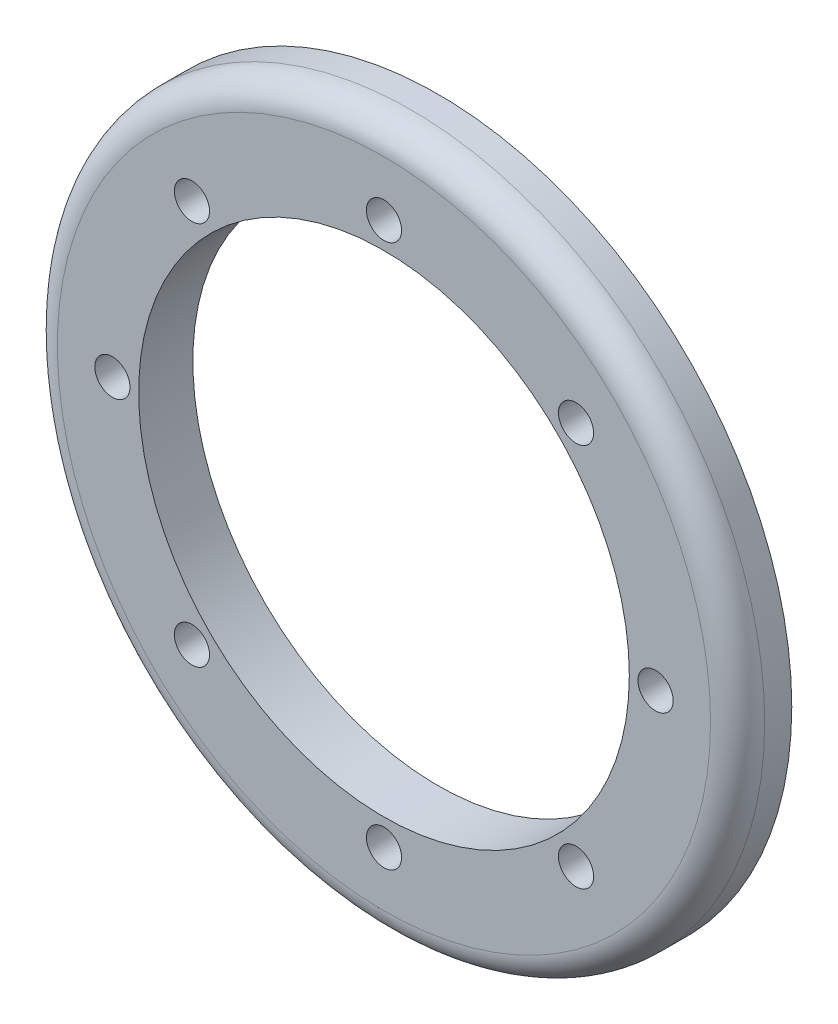
ISO-10303-21;
HEADER;
FILE_DESCRIPTION(('STEP AP214'),'2;1');
FILE_NAME('part.step','',(''),(''),'','','');
FILE_SCHEMA(('AUTOMOTIVE_DESIGN { 1 0 10303 214 1 1 1 1 }'));
ENDSEC;
DATA;
#1=APPLICATION_CONTEXT('core data for automotive mechanical design processes');
#2=APPLICATION_PROTOCOL_DEFINITION('international standard','automotive_design',2000,#1);
#3=PRODUCT_CONTEXT('',#1,'mechanical');
#4=PRODUCT('Part','Part','',(#3));
#5=PRODUCT_RELATED_PRODUCT_CATEGORY('part','',(#4));
#6=PRODUCT_DEFINITION_FORMATION('','',#4);
#7=PRODUCT_DEFINITION_CONTEXT('part definition',#1,'design');
#8=PRODUCT_DEFINITION('design','',#6,#7);
#9=PRODUCT_DEFINITION_SHAPE('','',#8);
#10=(LENGTH_UNIT() NAMED_UNIT(*) SI_UNIT(.MILLI.,.METRE.));
#11=(NAMED_UNIT(*) PLANE_ANGLE_UNIT() SI_UNIT($,.RADIAN.));
#12=(NAMED_UNIT(*) SI_UNIT($,.STERADIAN.) SOLID_ANGLE_UNIT());
#13=UNCERTAINTY_MEASURE_WITH_UNIT(LENGTH_MEASURE(1.E-05),#10,'distance_accuracy_value','');
#14=(GEOMETRIC_REPRESENTATION_CONTEXT(3) GLOBAL_UNCERTAINTY_ASSIGNED_CONTEXT((#13)) GLOBAL_UNIT_ASSIGNED_CONTEXT((#10,
#11,#12)) REPRESENTATION_CONTEXT('',''));
#15=CARTESIAN_POINT('',(0.,0.,0.));
#16=DIRECTION('',(0.,0.,1.));
#17=DIRECTION('',(1.,0.,0.));
#18=AXIS2_PLACEMENT_3D('',#15,#16,#17);
#19=CARTESIAN_POINT('',(35.4614050765051,-35.4614050765057,10.));
#20=DIRECTION('',(0.,0.,-1.));
#21=DIRECTION('',(-1.,0.,0.));
#22=AXIS2_PLACEMENT_3D('',#19,#20,#21);
#23=CYLINDRICAL_SURFACE('',#22,1.65);
#24=CARTESIAN_POINT('',(35.4614050765051,-35.4614050765057,0.));
#25=DIRECTION('',(0.,0.,1.));
#26=DIRECTION('',(1.,0.,0.));
#27=AXIS2_PLACEMENT_3D('',#24,#25,#26);
#28=CIRCLE('',#27,1.65);
#29=CARTESIAN_POINT('',(37.1114050765051,-35.4614050765057,0.));
#30=VERTEX_POINT('',#29);
#31=EDGE_CURVE('E104',#30,#30,#28,.T.);
#32=ORIENTED_EDGE('',*,*,#31,.F.);
#33=EDGE_LOOP('',(#32));
#34=FACE_BOUND('',#33,.T.);
#35=CARTESIAN_POINT('',(35.4614050765051,-35.4614050765057,4.));
#36=DIRECTION('',(0.,0.,1.));
#37=DIRECTION('',(1.,0.,0.));
#38=AXIS2_PLACEMENT_3D('',#35,#36,#37);
#39=CIRCLE('',#38,1.65);
#40=CARTESIAN_POINT('',(37.1114050765051,-35.4614050765057,4.));
#41=VERTEX_POINT('',#40);
#42=EDGE_CURVE('E39',#41,#41,#39,.T.);
#43=ORIENTED_EDGE('',*,*,#42,.T.);
#44=EDGE_LOOP('',(#43));
#45=FACE_BOUND('',#44,.T.);
#46=ADVANCED_FACE('F35',(#34,#45),#23,.F.);
#47=CARTESIAN_POINT('',(-5.20417042793042E-13,-50.15,10.));
#48=DIRECTION('',(0.,0.,-1.));
#49=DIRECTION('',(-1.,0.,0.));
#50=AXIS2_PLACEMENT_3D('',#47,#48,#49);
#51=CYLINDRICAL_SURFACE('',#50,1.65);
#52=CARTESIAN_POINT('',(-5.20417042793042E-13,-50.15,0.));
#53=DIRECTION('',(0.,0.,1.));
#54=DIRECTION('',(1.,0.,0.));
#55=AXIS2_PLACEMENT_3D('',#52,#53,#54);
#56=CIRCLE('',#55,1.65);
#57=CARTESIAN_POINT('',(1.64999999999948,-50.15,0.));
#58=VERTEX_POINT('',#57);
#59=EDGE_CURVE('E101',#58,#58,#56,.T.);
#60=ORIENTED_EDGE('',*,*,#59,.F.);
#61=EDGE_LOOP('',(#60));
#62=FACE_BOUND('',#61,.T.);
#63=CARTESIAN_POINT('',(-5.20417042793042E-13,-50.15,4.));
#64=DIRECTION('',(0.,0.,1.));
#65=DIRECTION('',(1.,0.,0.));
#66=AXIS2_PLACEMENT_3D('',#63,#64,#65);
#67=CIRCLE('',#66,1.65);
#68=CARTESIAN_POINT('',(1.64999999999948,-50.15,4.));
#69=VERTEX_POINT('',#68);
#70=EDGE_CURVE('E70',#69,#69,#67,.T.);
#71=ORIENTED_EDGE('',*,*,#70,.T.);
#72=EDGE_LOOP('',(#71));
#73=FACE_BOUND('',#72,.T.);
#74=ADVANCED_FACE('F231',(#62,#73),#51,.F.);
#75=CARTESIAN_POINT('',(-35.4614050765058,-35.4614050765049,10.));
#76=DIRECTION('',(0.,0.,-1.));
#77=DIRECTION('',(-1.,0.,0.));
#78=AXIS2_PLACEMENT_3D('',#75,#76,#77);
#79=CYLINDRICAL_SURFACE('',#78,1.65);
#80=CARTESIAN_POINT('',(-35.4614050765058,-35.4614050765049,0.));
#81=DIRECTION('',(0.,0.,1.));
#82=DIRECTION('',(1.,0.,0.));
#83=AXIS2_PLACEMENT_3D('',#80,#81,#82);
#84=CIRCLE('',#83,1.65);
#85=CARTESIAN_POINT('',(-33.8114050765058,-35.4614050765049,0.));
#86=VERTEX_POINT('',#85);
#87=EDGE_CURVE('E98',#86,#86,#84,.T.);
#88=ORIENTED_EDGE('',*,*,#87,.F.);
#89=EDGE_LOOP('',(#88));
#90=FACE_BOUND('',#89,.T.);
#91=CARTESIAN_POINT('',(-35.4614050765058,-35.4614050765049,4.));
#92=DIRECTION('',(0.,0.,1.));
#93=DIRECTION('',(1.,0.,0.));
#94=AXIS2_PLACEMENT_3D('',#91,#92,#93);
#95=CIRCLE('',#94,1.65);
#96=CARTESIAN_POINT('',(-33.8114050765058,-35.4614050765049,4.));
#97=VERTEX_POINT('',#96);
#98=EDGE_CURVE('E68',#97,#97,#95,.T.);
#99=ORIENTED_EDGE('',*,*,#98,.T.);
#100=EDGE_LOOP('',(#99));
#101=FACE_BOUND('',#100,.T.);
#102=ADVANCED_FACE('F237',(#90,#101),#79,.F.);
#103=CARTESIAN_POINT('',(-50.15,6.90419943438769E-13,10.));
#104=DIRECTION('',(0.,0.,-1.));
#105=DIRECTION('',(-1.,0.,0.));
#106=AXIS2_PLACEMENT_3D('',#103,#104,#105);
#107=CYLINDRICAL_SURFACE('',#106,1.65);
#108=CARTESIAN_POINT('',(-50.15,6.90419943438769E-13,0.));
#109=DIRECTION('',(0.,0.,1.));
#110=DIRECTION('',(1.,0.,0.));
#111=AXIS2_PLACEMENT_3D('',#108,#109,#110);
#112=CIRCLE('',#111,1.65);
#113=CARTESIAN_POINT('',(-48.5,6.90419943438769E-13,0.));
#114=VERTEX_POINT('',#113);
#115=EDGE_CURVE('E95',#114,#114,#112,.T.);
#116=ORIENTED_EDGE('',*,*,#115,.F.);
#117=EDGE_LOOP('',(#116));
#118=FACE_BOUND('',#117,.T.);
#119=CARTESIAN_POINT('',(-50.15,6.90419943438769E-13,4.));
#120=DIRECTION('',(0.,0.,1.));
#121=DIRECTION('',(1.,0.,0.));
#122=AXIS2_PLACEMENT_3D('',#119,#120,#121);
#123=CIRCLE('',#122,1.65);
#124=CARTESIAN_POINT('',(-48.5,6.90419943438769E-13,4.));
#125=VERTEX_POINT('',#124);
#126=EDGE_CURVE('E65',#125,#125,#123,.T.);
#127=ORIENTED_EDGE('',*,*,#126,.T.);
#128=EDGE_LOOP('',(#127));
#129=FACE_BOUND('',#128,.T.);
#130=ADVANCED_FACE('F243',(#118,#129),#107,.F.);
#131=CARTESIAN_POINT('',(-35.4614050765048,35.4614050765059,10.));
#132=DIRECTION('',(0.,0.,-1.));
#133=DIRECTION('',(-1.,0.,0.));
#134=AXIS2_PLACEMENT_3D('',#131,#132,#133);
#135=CYLINDRICAL_SURFACE('',#134,1.65000000000001);
#136=CARTESIAN_POINT('',(-35.4614050765048,35.4614050765059,0.));
#137=DIRECTION('',(0.,0.,1.));
#138=DIRECTION('',(1.,0.,0.));
#139=AXIS2_PLACEMENT_3D('',#136,#137,#138);
#140=CIRCLE('',#139,1.65000000000001);
#141=CARTESIAN_POINT('',(-33.8114050765048,35.4614050765059,0.));
#142=VERTEX_POINT('',#141);
#143=EDGE_CURVE('E92',#142,#142,#140,.T.);
#144=ORIENTED_EDGE('',*,*,#143,.F.);
#145=EDGE_LOOP('',(#144));
#146=FACE_BOUND('',#145,.T.);
#147=CARTESIAN_POINT('',(-35.4614050765048,35.4614050765059,4.));
#148=DIRECTION('',(0.,0.,1.));
#149=DIRECTION('',(1.,0.,0.));
#150=AXIS2_PLACEMENT_3D('',#147,#148,#149);
#151=CIRCLE('',#150,1.65000000000001);
#152=CARTESIAN_POINT('',(-33.8114050765048,35.4614050765059,4.));
#153=VERTEX_POINT('',#152);
#154=EDGE_CURVE('E62',#153,#153,#151,.T.);
#155=ORIENTED_EDGE('',*,*,#154,.T.);
#156=EDGE_LOOP('',(#155));
#157=FACE_BOUND('',#156,.T.);
#158=ADVANCED_FACE('F247',(#146,#157),#135,.F.);
#159=CARTESIAN_POINT('',(8.50014503228635E-13,50.15,10.));
#160=DIRECTION('',(0.,0.,-1.));
#161=DIRECTION('',(-1.,0.,0.));
#162=AXIS2_PLACEMENT_3D('',#159,#160,#161);
#163=CYLINDRICAL_SURFACE('',#162,1.65);
#164=CARTESIAN_POINT('',(8.50014503228635E-13,50.15,0.));
#165=DIRECTION('',(0.,0.,1.));
#166=DIRECTION('',(1.,0.,0.));
#167=AXIS2_PLACEMENT_3D('',#164,#165,#166);
#168=CIRCLE('',#167,1.65);
#169=CARTESIAN_POINT('',(1.65000000000085,50.15,0.));
#170=VERTEX_POINT('',#169);
#171=EDGE_CURVE('E84',#170,#170,#168,.T.);
#172=ORIENTED_EDGE('',*,*,#171,.F.);
#173=EDGE_LOOP('',(#172));
#174=FACE_BOUND('',#173,.T.);
#175=CARTESIAN_POINT('',(8.50014503228635E-13,50.15,4.));
#176=DIRECTION('',(0.,0.,1.));
#177=DIRECTION('',(1.,0.,0.));
#178=AXIS2_PLACEMENT_3D('',#175,#176,#177);
#179=CIRCLE('',#178,1.65);
#180=CARTESIAN_POINT('',(1.65000000000085,50.15,4.));
#181=VERTEX_POINT('',#180);
#182=EDGE_CURVE('E59',#181,#181,#179,.T.);
#183=ORIENTED_EDGE('',*,*,#182,.T.);
#184=EDGE_LOOP('',(#183));
#185=FACE_BOUND('',#184,.T.);
#186=ADVANCED_FACE('F142',(#174,#185),#163,.F.);
#187=CARTESIAN_POINT('',(35.461405076506,35.4614050765047,10.));
#188=DIRECTION('',(0.,0.,-1.));
#189=DIRECTION('',(-1.,0.,0.));
#190=AXIS2_PLACEMENT_3D('',#187,#188,#189);
#191=CYLINDRICAL_SURFACE('',#190,1.65);
#192=CARTESIAN_POINT('',(35.461405076506,35.4614050765047,0.));
#193=DIRECTION('',(0.,0.,1.));
#194=DIRECTION('',(1.,0.,0.));
#195=AXIS2_PLACEMENT_3D('',#192,#193,#194);
#196=CIRCLE('',#195,1.65);
#197=CARTESIAN_POINT('',(37.111405076506,35.4614050765047,0.));
#198=VERTEX_POINT('',#197);
#199=EDGE_CURVE('E79',#198,#198,#196,.T.);
#200=ORIENTED_EDGE('',*,*,#199,.F.);
#201=EDGE_LOOP('',(#200));
#202=FACE_BOUND('',#201,.T.);
#203=CARTESIAN_POINT('',(35.461405076506,35.4614050765047,4.));
#204=DIRECTION('',(0.,0.,1.));
#205=DIRECTION('',(1.,0.,0.));
#206=AXIS2_PLACEMENT_3D('',#203,#204,#205);
#207=CIRCLE('',#206,1.65);
#208=CARTESIAN_POINT('',(37.111405076506,35.4614050765047,4.));
#209=VERTEX_POINT('',#208);
#210=EDGE_CURVE('E55',#209,#209,#207,.T.);
#211=ORIENTED_EDGE('',*,*,#210,.T.);
#212=EDGE_LOOP('',(#211));
#213=FACE_BOUND('',#212,.T.);
#214=ADVANCED_FACE('F138',(#202,#213),#191,.F.);
#215=CARTESIAN_POINT('',(50.15,-1.03736463863413E-12,10.));
#216=DIRECTION('',(0.,0.,-1.));
#217=DIRECTION('',(-1.,0.,0.));
#218=AXIS2_PLACEMENT_3D('',#215,#216,#217);
#219=CYLINDRICAL_SURFACE('',#218,1.65);
#220=CARTESIAN_POINT('',(50.15,-1.03736463863413E-12,0.));
#221=DIRECTION('',(0.,0.,1.));
#222=DIRECTION('',(1.,0.,0.));
#223=AXIS2_PLACEMENT_3D('',#220,#221,#222);
#224=CIRCLE('',#223,1.65);
#225=CARTESIAN_POINT('',(51.8,-1.03736463863413E-12,0.));
#226=VERTEX_POINT('',#225);
#227=EDGE_CURVE('E75',#226,#226,#224,.T.);
#228=ORIENTED_EDGE('',*,*,#227,.F.);
#229=EDGE_LOOP('',(#228));
#230=FACE_BOUND('',#229,.T.);
#231=CARTESIAN_POINT('',(50.15,-1.03736463863413E-12,4.));
#232=DIRECTION('',(0.,0.,1.));
#233=DIRECTION('',(1.,0.,0.));
#234=AXIS2_PLACEMENT_3D('',#231,#232,#233);
#235=CIRCLE('',#234,1.65);
#236=CARTESIAN_POINT('',(51.8,-1.03736463863413E-12,4.));
#237=VERTEX_POINT('',#236);
#238=EDGE_CURVE('E52',#237,#237,#235,.T.);
#239=ORIENTED_EDGE('',*,*,#238,.T.);
#240=EDGE_LOOP('',(#239));
#241=FACE_BOUND('',#240,.T.);
#242=ADVANCED_FACE('F141',(#230,#241),#219,.F.);
#243=CARTESIAN_POINT('',(0.,0.,10.));
#244=DIRECTION('',(0.,0.,1.));
#245=DIRECTION('',(1.,0.,0.));
#246=AXIS2_PLACEMENT_3D('',#243,#244,#245);
#247=PLANE('',#246);
#248=CARTESIAN_POINT('',(-50.15,6.90419943438769E-13,10.));
#249=DIRECTION('',(0.,0.,1.));
#250=DIRECTION('',(1.,0.,0.));
#251=AXIS2_PLACEMENT_3D('',#248,#249,#250);
#252=CIRCLE('',#251,3.25);
#253=CARTESIAN_POINT('',(-46.9,6.90419943438769E-13,10.));
#254=VERTEX_POINT('',#253);
#255=EDGE_CURVE('E168',#254,#254,#252,.T.);
#256=ORIENTED_EDGE('',*,*,#255,.F.);
#257=EDGE_LOOP('',(#256));
#258=FACE_BOUND('',#257,.T.);
#259=CARTESIAN_POINT('',(-5.20417042793042E-13,-50.15,10.));
#260=DIRECTION('',(0.,0.,1.));
#261=DIRECTION('',(1.,0.,0.));
#262=AXIS2_PLACEMENT_3D('',#259,#260,#261);
#263=CIRCLE('',#262,3.25);
#264=CARTESIAN_POINT('',(3.24999999999948,-50.15,10.));
#265=VERTEX_POINT('',#264);
#266=EDGE_CURVE('E176',#265,#265,#263,.T.);
#267=ORIENTED_EDGE('',*,*,#266,.F.);
#268=EDGE_LOOP('',(#267));
#269=FACE_BOUND('',#268,.T.);
#270=CARTESIAN_POINT('',(35.4614050765051,-35.4614050765057,10.));
#271=DIRECTION('',(0.,0.,1.));
#272=DIRECTION('',(1.,0.,0.));
#273=AXIS2_PLACEMENT_3D('',#270,#271,#272);
#274=CIRCLE('',#273,3.25);
#275=CARTESIAN_POINT('',(38.7114050765051,-35.4614050765057,10.));
#276=VERTEX_POINT('',#275);
#277=EDGE_CURVE('E165',#276,#276,#274,.T.);
#278=ORIENTED_EDGE('',*,*,#277,.F.);
#279=EDGE_LOOP('',(#278));
#280=FACE_BOUND('',#279,.T.);
#281=CARTESIAN_POINT('',(50.15,-1.03736463863413E-12,10.));
#282=DIRECTION('',(0.,0.,1.));
#283=DIRECTION('',(1.,0.,0.));
#284=AXIS2_PLACEMENT_3D('',#281,#282,#283);
#285=CIRCLE('',#284,3.25);
#286=CARTESIAN_POINT('',(53.4,-1.03736463863413E-12,10.));
#287=VERTEX_POINT('',#286);
#288=EDGE_CURVE('E156',#287,#287,#285,.T.);
#289=ORIENTED_EDGE('',*,*,#288,.F.);
#290=EDGE_LOOP('',(#289));
#291=FACE_BOUND('',#290,.T.);
#292=CARTESIAN_POINT('',(35.461405076506,35.4614050765047,10.));
#293=DIRECTION('',(0.,0.,1.));
#294=DIRECTION('',(1.,0.,0.));
#295=AXIS2_PLACEMENT_3D('',#292,#293,#294);
#296=CIRCLE('',#295,3.25);
#297=CARTESIAN_POINT('',(38.711405076506,35.4614050765047,10.));
#298=VERTEX_POINT('',#297);
#299=EDGE_CURVE('E155',#298,#298,#296,.T.);
#300=ORIENTED_EDGE('',*,*,#299,.F.);
#301=EDGE_LOOP('',(#300));
#302=FACE_BOUND('',#301,.T.);
#303=CARTESIAN_POINT('',(8.50014503228635E-13,50.15,10.));
#304=DIRECTION('',(0.,0.,1.));
#305=DIRECTION('',(1.,0.,0.));
#306=AXIS2_PLACEMENT_3D('',#303,#304,#305);
#307=CIRCLE('',#306,3.25);
#308=CARTESIAN_POINT('',(3.25000000000085,50.15,10.));
#309=VERTEX_POINT('',#308);
#310=EDGE_CURVE('E194',#309,#309,#307,.T.);
#311=ORIENTED_EDGE('',*,*,#310,.F.);
#312=EDGE_LOOP('',(#311));
#313=FACE_BOUND('',#312,.T.);
#314=CARTESIAN_POINT('',(-35.4614050765048,35.4614050765059,10.));
#315=DIRECTION('',(0.,0.,1.));
#316=DIRECTION('',(1.,0.,0.));
#317=AXIS2_PLACEMENT_3D('',#314,#315,#316);
#318=CIRCLE('',#317,3.25);
#319=CARTESIAN_POINT('',(-32.2114050765048,35.4614050765059,10.));
#320=VERTEX_POINT('',#319);
#321=EDGE_CURVE('E188',#320,#320,#318,.T.);
#322=ORIENTED_EDGE('',*,*,#321,.F.);
#323=EDGE_LOOP('',(#322));
#324=FACE_BOUND('',#323,.T.);
#325=CARTESIAN_POINT('',(-35.4614050765058,-35.4614050765049,10.));
#326=DIRECTION('',(0.,0.,1.));
#327=DIRECTION('',(1.,0.,0.));
#328=AXIS2_PLACEMENT_3D('',#325,#326,#327);
#329=CIRCLE('',#328,3.25);
#330=CARTESIAN_POINT('',(-32.2114050765058,-35.4614050765049,10.));
#331=VERTEX_POINT('',#330);
#332=EDGE_CURVE('E182',#331,#331,#329,.T.);
#333=ORIENTED_EDGE('',*,*,#332,.F.);
#334=EDGE_LOOP('',(#333));
#335=FACE_BOUND('',#334,.T.);
#336=CARTESIAN_POINT('',(0.,0.,10.));
#337=DIRECTION('',(0.,0.,1.));
#338=DIRECTION('',(1.,0.,0.));
#339=AXIS2_PLACEMENT_3D('',#336,#337,#338);
#340=CIRCLE('',#339,60.3);
#341=CARTESIAN_POINT('',(60.3,0.,10.));
#342=VERTEX_POINT('',#341);
#343=EDGE_CURVE('E43',#342,#342,#340,.T.);
#344=ORIENTED_EDGE('',*,*,#343,.T.);
#345=EDGE_LOOP('',(#344));
#346=FACE_BOUND('',#345,.T.);
#347=CARTESIAN_POINT('',(0.,0.,10.));
#348=DIRECTION('',(0.,0.,1.));
#349=DIRECTION('',(1.,0.,0.));
#350=AXIS2_PLACEMENT_3D('',#347,#348,#349);
#351=CIRCLE('',#350,45.3);
#352=CARTESIAN_POINT('',(45.3,0.,10.));
#353=VERTEX_POINT('',#352);
#354=EDGE_CURVE('E108',#353,#353,#351,.T.);
#355=ORIENTED_EDGE('',*,*,#354,.F.);
#356=EDGE_LOOP('',(#355));
#357=FACE_BOUND('',#356,.T.);
#358=ADVANCED_FACE('F120',(#258,#269,#280,#291,#302,#313,#324,#335,#346,#357),#247,.T.);
#359=CARTESIAN_POINT('',(0.,0.,0.));
#360=DIRECTION('',(0.,0.,1.));
#361=DIRECTION('',(1.,0.,0.));
#362=AXIS2_PLACEMENT_3D('',#359,#360,#361);
#363=PLANE('',#362);
#364=CARTESIAN_POINT('',(0.,0.,0.));
#365=DIRECTION('',(0.,0.,1.));
#366=DIRECTION('',(1.,0.,0.));
#367=AXIS2_PLACEMENT_3D('',#364,#365,#366);
#368=CIRCLE('',#367,65.3);
#369=CARTESIAN_POINT('',(65.3,0.,0.));
#370=VERTEX_POINT('',#369);
#371=EDGE_CURVE('E48',#370,#370,#368,.T.);
#372=ORIENTED_EDGE('',*,*,#371,.F.);
#373=EDGE_LOOP('',(#372));
#374=FACE_BOUND('',#373,.T.);
#375=CARTESIAN_POINT('',(0.,0.,0.));
#376=DIRECTION('',(0.,0.,1.));
#377=DIRECTION('',(1.,0.,0.));
#378=AXIS2_PLACEMENT_3D('',#375,#376,#377);
#379=CIRCLE('',#378,45.3);
#380=CARTESIAN_POINT('',(45.3,0.,0.));
#381=VERTEX_POINT('',#380);
#382=EDGE_CURVE('E107',#381,#381,#379,.T.);
#383=ORIENTED_EDGE('',*,*,#382,.T.);
#384=EDGE_LOOP('',(#383));
#385=FACE_BOUND('',#384,.T.);
#386=ORIENTED_EDGE('',*,*,#31,.T.);
#387=EDGE_LOOP('',(#386));
#388=FACE_BOUND('',#387,.T.);
#389=ORIENTED_EDGE('',*,*,#59,.T.);
#390=EDGE_LOOP('',(#389));
#391=FACE_BOUND('',#390,.T.);
#392=ORIENTED_EDGE('',*,*,#87,.T.);
#393=EDGE_LOOP('',(#392));
#394=FACE_BOUND('',#393,.T.);
#395=ORIENTED_EDGE('',*,*,#115,.T.);
#396=EDGE_LOOP('',(#395));
#397=FACE_BOUND('',#396,.T.);
#398=ORIENTED_EDGE('',*,*,#143,.T.);
#399=EDGE_LOOP('',(#398));
#400=FACE_BOUND('',#399,.T.);
#401=ORIENTED_EDGE('',*,*,#171,.T.);
#402=EDGE_LOOP('',(#401));
#403=FACE_BOUND('',#402,.T.);
#404=ORIENTED_EDGE('',*,*,#199,.T.);
#405=EDGE_LOOP('',(#404));
#406=FACE_BOUND('',#405,.T.);
#407=ORIENTED_EDGE('',*,*,#227,.T.);
#408=EDGE_LOOP('',(#407));
#409=FACE_BOUND('',#408,.T.);
#410=ADVANCED_FACE('F117',(#374,#385,#388,#391,#394,#397,#400,#403,#406,#409),#363,.F.);
#411=CARTESIAN_POINT('',(0.,0.,10.));
#412=DIRECTION('',(0.,0.,-1.));
#413=DIRECTION('',(-1.,0.,0.));
#414=AXIS2_PLACEMENT_3D('',#411,#412,#413);
#415=CYLINDRICAL_SURFACE('',#414,65.3);
#416=CARTESIAN_POINT('',(0.,0.,5.));
#417=DIRECTION('',(0.,0.,1.));
#418=DIRECTION('',(1.,0.,0.));
#419=AXIS2_PLACEMENT_3D('',#416,#417,#418);
#420=CIRCLE('',#419,65.3);
#421=CARTESIAN_POINT('',(65.3,0.,5.));
#422=VERTEX_POINT('',#421);
#423=EDGE_CURVE('E10',#422,#422,#420,.F.);
#424=ORIENTED_EDGE('',*,*,#423,.T.);
#425=EDGE_LOOP('',(#424));
#426=FACE_BOUND('',#425,.T.);
#427=ORIENTED_EDGE('',*,*,#371,.T.);
#428=EDGE_LOOP('',(#427));
#429=FACE_BOUND('',#428,.T.);
#430=ADVANCED_FACE('F115',(#426,#429),#415,.T.);
#431=CARTESIAN_POINT('',(0.,0.,10.));
#432=DIRECTION('',(0.,0.,-1.));
#433=DIRECTION('',(-1.,0.,0.));
#434=AXIS2_PLACEMENT_3D('',#431,#432,#433);
#435=CYLINDRICAL_SURFACE('',#434,45.3);
#436=ORIENTED_EDGE('',*,*,#354,.T.);
#437=EDGE_LOOP('',(#436));
#438=FACE_BOUND('',#437,.T.);
#439=ORIENTED_EDGE('',*,*,#382,.F.);
#440=EDGE_LOOP('',(#439));
#441=FACE_BOUND('',#440,.T.);
#442=ADVANCED_FACE('F219',(#438,#441),#435,.F.);
#443=CARTESIAN_POINT('',(0.,0.,5.));
#444=DIRECTION('',(0.,0.,1.));
#445=DIRECTION('',(1.,0.,0.));
#446=AXIS2_PLACEMENT_3D('',#443,#444,#445);
#447=TOROIDAL_SURFACE('',#446,60.3,5.);
#448=ORIENTED_EDGE('',*,*,#423,.F.);
#449=EDGE_LOOP('',(#448));
#450=FACE_BOUND('',#449,.T.);
#451=ORIENTED_EDGE('',*,*,#343,.F.);
#452=EDGE_LOOP('',(#451));
#453=FACE_BOUND('',#452,.T.);
#454=ADVANCED_FACE('F37',(#450,#453),#447,.T.);
#455=CARTESIAN_POINT('',(50.15,-1.03736463863413E-12,4.));
#456=DIRECTION('',(0.,0.,1.));
#457=DIRECTION('',(1.,0.,0.));
#458=AXIS2_PLACEMENT_3D('',#455,#456,#457);
#459=CYLINDRICAL_SURFACE('',#458,3.25);
#460=CARTESIAN_POINT('',(50.15,-1.03736463863413E-12,4.));
#461=DIRECTION('',(0.,0.,1.));
#462=DIRECTION('',(1.,0.,0.));
#463=AXIS2_PLACEMENT_3D('',#460,#461,#462);
#464=CIRCLE('',#463,3.25);
#465=CARTESIAN_POINT('',(53.4,-1.03736463863413E-12,4.));
#466=VERTEX_POINT('',#465);
#467=EDGE_CURVE('E160',#466,#466,#464,.T.);
#468=ORIENTED_EDGE('',*,*,#467,.F.);
#469=EDGE_LOOP('',(#468));
#470=FACE_BOUND('',#469,.T.);
#471=ORIENTED_EDGE('',*,*,#288,.T.);
#472=EDGE_LOOP('',(#471));
#473=FACE_BOUND('',#472,.T.);
#474=ADVANCED_FACE('F227',(#470,#473),#459,.F.);
#475=CARTESIAN_POINT('',(50.15,-1.03736463863413E-12,4.));
#476=DIRECTION('',(0.,0.,1.));
#477=DIRECTION('',(1.,0.,0.));
#478=AXIS2_PLACEMENT_3D('',#475,#476,#477);
#479=PLANE('',#478);
#480=ORIENTED_EDGE('',*,*,#238,.F.);
#481=EDGE_LOOP('',(#480));
#482=FACE_BOUND('',#481,.T.);
#483=ORIENTED_EDGE('',*,*,#467,.T.);
#484=EDGE_LOOP('',(#483));
#485=FACE_BOUND('',#484,.T.);
#486=ADVANCED_FACE('F260',(#482,#485),#479,.T.);
#487=CARTESIAN_POINT('',(35.461405076506,35.4614050765047,4.));
#488=DIRECTION('',(0.,0.,1.));
#489=DIRECTION('',(1.,0.,0.));
#490=AXIS2_PLACEMENT_3D('',#487,#488,#489);
#491=CYLINDRICAL_SURFACE('',#490,3.25);
#492=CARTESIAN_POINT('',(35.461405076506,35.4614050765047,4.));
#493=DIRECTION('',(0.,0.,1.));
#494=DIRECTION('',(1.,0.,0.));
#495=AXIS2_PLACEMENT_3D('',#492,#493,#494);
#496=CIRCLE('',#495,3.25);
#497=CARTESIAN_POINT('',(38.711405076506,35.4614050765047,4.));
#498=VERTEX_POINT('',#497);
#499=EDGE_CURVE('E87',#498,#498,#496,.T.);
#500=ORIENTED_EDGE('',*,*,#499,.F.);
#501=EDGE_LOOP('',(#500));
#502=FACE_BOUND('',#501,.T.);
#503=ORIENTED_EDGE('',*,*,#299,.T.);
#504=EDGE_LOOP('',(#503));
#505=FACE_BOUND('',#504,.T.);
#506=ADVANCED_FACE('F150',(#502,#505),#491,.F.);
#507=CARTESIAN_POINT('',(35.461405076506,35.4614050765047,4.));
#508=DIRECTION('',(0.,0.,1.));
#509=DIRECTION('',(1.,0.,0.));
#510=AXIS2_PLACEMENT_3D('',#507,#508,#509);
#511=PLANE('',#510);
#512=ORIENTED_EDGE('',*,*,#210,.F.);
#513=EDGE_LOOP('',(#512));
#514=FACE_BOUND('',#513,.T.);
#515=ORIENTED_EDGE('',*,*,#499,.T.);
#516=EDGE_LOOP('',(#515));
#517=FACE_BOUND('',#516,.T.);
#518=ADVANCED_FACE('F146',(#514,#517),#511,.T.);
#519=CARTESIAN_POINT('',(8.50014503228635E-13,50.15,4.));
#520=DIRECTION('',(0.,0.,1.));
#521=DIRECTION('',(1.,0.,0.));
#522=AXIS2_PLACEMENT_3D('',#519,#520,#521);
#523=CYLINDRICAL_SURFACE('',#522,3.25);
#524=CARTESIAN_POINT('',(8.50014503228635E-13,50.15,4.));
#525=DIRECTION('',(0.,0.,1.));
#526=DIRECTION('',(1.,0.,0.));
#527=AXIS2_PLACEMENT_3D('',#524,#525,#526);
#528=CIRCLE('',#527,3.25);
#529=CARTESIAN_POINT('',(3.25000000000085,50.15,4.));
#530=VERTEX_POINT('',#529);
#531=EDGE_CURVE('E158',#530,#530,#528,.T.);
#532=ORIENTED_EDGE('',*,*,#531,.F.);
#533=EDGE_LOOP('',(#532));
#534=FACE_BOUND('',#533,.T.);
#535=ORIENTED_EDGE('',*,*,#310,.T.);
#536=EDGE_LOOP('',(#535));
#537=FACE_BOUND('',#536,.T.);
#538=ADVANCED_FACE('F149',(#534,#537),#523,.F.);
#539=CARTESIAN_POINT('',(8.50014503228635E-13,50.15,4.));
#540=DIRECTION('',(0.,0.,1.));
#541=DIRECTION('',(1.,0.,0.));
#542=AXIS2_PLACEMENT_3D('',#539,#540,#541);
#543=PLANE('',#542);
#544=ORIENTED_EDGE('',*,*,#182,.F.);
#545=EDGE_LOOP('',(#544));
#546=FACE_BOUND('',#545,.T.);
#547=ORIENTED_EDGE('',*,*,#531,.T.);
#548=EDGE_LOOP('',(#547));
#549=FACE_BOUND('',#548,.T.);
#550=ADVANCED_FACE('F200',(#546,#549),#543,.T.);
#551=CARTESIAN_POINT('',(-35.4614050765048,35.4614050765059,4.));
#552=DIRECTION('',(0.,0.,1.));
#553=DIRECTION('',(1.,0.,0.));
#554=AXIS2_PLACEMENT_3D('',#551,#552,#553);
#555=CYLINDRICAL_SURFACE('',#554,3.25);
#556=CARTESIAN_POINT('',(-35.4614050765048,35.4614050765059,4.));
#557=DIRECTION('',(0.,0.,1.));
#558=DIRECTION('',(1.,0.,0.));
#559=AXIS2_PLACEMENT_3D('',#556,#557,#558);
#560=CIRCLE('',#559,3.25);
#561=CARTESIAN_POINT('',(-32.2114050765048,35.4614050765059,4.));
#562=VERTEX_POINT('',#561);
#563=EDGE_CURVE('E191',#562,#562,#560,.T.);
#564=ORIENTED_EDGE('',*,*,#563,.F.);
#565=EDGE_LOOP('',(#564));
#566=FACE_BOUND('',#565,.T.);
#567=ORIENTED_EDGE('',*,*,#321,.T.);
#568=EDGE_LOOP('',(#567));
#569=FACE_BOUND('',#568,.T.);
#570=ADVANCED_FACE('F262',(#566,#569),#555,.F.);
#571=CARTESIAN_POINT('',(-35.4614050765048,35.4614050765059,4.));
#572=DIRECTION('',(0.,0.,1.));
#573=DIRECTION('',(1.,0.,0.));
#574=AXIS2_PLACEMENT_3D('',#571,#572,#573);
#575=PLANE('',#574);
#576=ORIENTED_EDGE('',*,*,#154,.F.);
#577=EDGE_LOOP('',(#576));
#578=FACE_BOUND('',#577,.T.);
#579=ORIENTED_EDGE('',*,*,#563,.T.);
#580=EDGE_LOOP('',(#579));
#581=FACE_BOUND('',#580,.T.);
#582=ADVANCED_FACE('F265',(#578,#581),#575,.T.);
#583=CARTESIAN_POINT('',(-50.15,6.90419943438769E-13,4.));
#584=DIRECTION('',(0.,0.,1.));
#585=DIRECTION('',(1.,0.,0.));
#586=AXIS2_PLACEMENT_3D('',#583,#584,#585);
#587=CYLINDRICAL_SURFACE('',#586,3.25);
#588=CARTESIAN_POINT('',(-50.15,6.90419943438769E-13,4.));
#589=DIRECTION('',(0.,0.,1.));
#590=DIRECTION('',(1.,0.,0.));
#591=AXIS2_PLACEMENT_3D('',#588,#589,#590);
#592=CIRCLE('',#591,3.25);
#593=CARTESIAN_POINT('',(-46.9,6.90419943438769E-13,4.));
#594=VERTEX_POINT('',#593);
#595=EDGE_CURVE('E56',#594,#594,#592,.T.);
#596=ORIENTED_EDGE('',*,*,#595,.F.);
#597=EDGE_LOOP('',(#596));
#598=FACE_BOUND('',#597,.T.);
#599=ORIENTED_EDGE('',*,*,#255,.T.);
#600=EDGE_LOOP('',(#599));
#601=FACE_BOUND('',#600,.T.);
#602=ADVANCED_FACE('F268',(#598,#601),#587,.F.);
#603=CARTESIAN_POINT('',(-50.15,6.90419943438769E-13,4.));
#604=DIRECTION('',(0.,0.,1.));
#605=DIRECTION('',(1.,0.,0.));
#606=AXIS2_PLACEMENT_3D('',#603,#604,#605);
#607=PLANE('',#606);
#608=ORIENTED_EDGE('',*,*,#126,.F.);
#609=EDGE_LOOP('',(#608));
#610=FACE_BOUND('',#609,.T.);
#611=ORIENTED_EDGE('',*,*,#595,.T.);
#612=EDGE_LOOP('',(#611));
#613=FACE_BOUND('',#612,.T.);
#614=ADVANCED_FACE('F281',(#610,#613),#607,.T.);
#615=CARTESIAN_POINT('',(-35.4614050765058,-35.4614050765049,4.));
#616=DIRECTION('',(0.,0.,1.));
#617=DIRECTION('',(1.,0.,0.));
#618=AXIS2_PLACEMENT_3D('',#615,#616,#617);
#619=CYLINDRICAL_SURFACE('',#618,3.25);
#620=CARTESIAN_POINT('',(-35.4614050765058,-35.4614050765049,4.));
#621=DIRECTION('',(0.,0.,1.));
#622=DIRECTION('',(1.,0.,0.));
#623=AXIS2_PLACEMENT_3D('',#620,#621,#622);
#624=CIRCLE('',#623,3.25);
#625=CARTESIAN_POINT('',(-32.2114050765058,-35.4614050765049,4.));
#626=VERTEX_POINT('',#625);
#627=EDGE_CURVE('E185',#626,#626,#624,.T.);
#628=ORIENTED_EDGE('',*,*,#627,.F.);
#629=EDGE_LOOP('',(#628));
#630=FACE_BOUND('',#629,.T.);
#631=ORIENTED_EDGE('',*,*,#332,.T.);
#632=EDGE_LOOP('',(#631));
#633=FACE_BOUND('',#632,.T.);
#634=ADVANCED_FACE('F277',(#630,#633),#619,.F.);
#635=CARTESIAN_POINT('',(-35.4614050765058,-35.4614050765049,4.));
#636=DIRECTION('',(0.,0.,1.));
#637=DIRECTION('',(1.,0.,0.));
#638=AXIS2_PLACEMENT_3D('',#635,#636,#637);
#639=PLANE('',#638);
#640=ORIENTED_EDGE('',*,*,#98,.F.);
#641=EDGE_LOOP('',(#640));
#642=FACE_BOUND('',#641,.T.);
#643=ORIENTED_EDGE('',*,*,#627,.T.);
#644=EDGE_LOOP('',(#643));
#645=FACE_BOUND('',#644,.T.);
#646=ADVANCED_FACE('F273',(#642,#645),#639,.T.);
#647=CARTESIAN_POINT('',(-5.20417042793042E-13,-50.15,4.));
#648=DIRECTION('',(0.,0.,1.));
#649=DIRECTION('',(1.,0.,0.));
#650=AXIS2_PLACEMENT_3D('',#647,#648,#649);
#651=CYLINDRICAL_SURFACE('',#650,3.25);
#652=CARTESIAN_POINT('',(-5.20417042793042E-13,-50.15,4.));
#653=DIRECTION('',(0.,0.,1.));
#654=DIRECTION('',(1.,0.,0.));
#655=AXIS2_PLACEMENT_3D('',#652,#653,#654);
#656=CIRCLE('',#655,3.25);
#657=CARTESIAN_POINT('',(3.24999999999948,-50.15,4.));
#658=VERTEX_POINT('',#657);
#659=EDGE_CURVE('E179',#658,#658,#656,.T.);
#660=ORIENTED_EDGE('',*,*,#659,.F.);
#661=EDGE_LOOP('',(#660));
#662=FACE_BOUND('',#661,.T.);
#663=ORIENTED_EDGE('',*,*,#266,.T.);
#664=EDGE_LOOP('',(#663));
#665=FACE_BOUND('',#664,.T.);
#666=ADVANCED_FACE('F276',(#662,#665),#651,.F.);
#667=CARTESIAN_POINT('',(-5.20417042793042E-13,-50.15,4.));
#668=DIRECTION('',(0.,0.,1.));
#669=DIRECTION('',(1.,0.,0.));
#670=AXIS2_PLACEMENT_3D('',#667,#668,#669);
#671=PLANE('',#670);
#672=ORIENTED_EDGE('',*,*,#70,.F.);
#673=EDGE_LOOP('',(#672));
#674=FACE_BOUND('',#673,.T.);
#675=ORIENTED_EDGE('',*,*,#659,.T.);
#676=EDGE_LOOP('',(#675));
#677=FACE_BOUND('',#676,.T.);
#678=ADVANCED_FACE('F283',(#674,#677),#671,.T.);
#679=CARTESIAN_POINT('',(35.4614050765051,-35.4614050765057,4.));
#680=DIRECTION('',(0.,0.,1.));
#681=DIRECTION('',(1.,0.,0.));
#682=AXIS2_PLACEMENT_3D('',#679,#680,#681);
#683=CYLINDRICAL_SURFACE('',#682,3.25);
#684=CARTESIAN_POINT('',(35.4614050765051,-35.4614050765057,4.));
#685=DIRECTION('',(0.,0.,1.));
#686=DIRECTION('',(1.,0.,0.));
#687=AXIS2_PLACEMENT_3D('',#684,#685,#686);
#688=CIRCLE('',#687,3.25);
#689=CARTESIAN_POINT('',(38.7114050765051,-35.4614050765057,4.));
#690=VERTEX_POINT('',#689);
#691=EDGE_CURVE('E173',#690,#690,#688,.T.);
#692=ORIENTED_EDGE('',*,*,#691,.F.);
#693=EDGE_LOOP('',(#692));
#694=FACE_BOUND('',#693,.T.);
#695=ORIENTED_EDGE('',*,*,#277,.T.);
#696=EDGE_LOOP('',(#695));
#697=FACE_BOUND('',#696,.T.);
#698=ADVANCED_FACE('F286',(#694,#697),#683,.F.);
#699=CARTESIAN_POINT('',(35.4614050765051,-35.4614050765057,4.));
#700=DIRECTION('',(0.,0.,1.));
#701=DIRECTION('',(1.,0.,0.));
#702=AXIS2_PLACEMENT_3D('',#699,#700,#701);
#703=PLANE('',#702);
#704=ORIENTED_EDGE('',*,*,#42,.F.);
#705=EDGE_LOOP('',(#704));
#706=FACE_BOUND('',#705,.T.);
#707=ORIENTED_EDGE('',*,*,#691,.T.);
#708=EDGE_LOOP('',(#707));
#709=FACE_BOUND('',#708,.T.);
#710=ADVANCED_FACE('F291',(#706,#709),#703,.T.);
#711=CLOSED_SHELL('',(#46,#74,#102,#130,#158,#186,#214,#242,#358,#410,#430,#442,#454,#474,#486,
#506,#518,#538,#550,#570,#582,#602,#614,#634,#646,#666,#678,#698,#710));
#712=MANIFOLD_SOLID_BREP('B2',#711);
#713=ADVANCED_BREP_SHAPE_REPRESENTATION('',(#18,#712),#14);
#714=SHAPE_DEFINITION_REPRESENTATION(#9,#713);
ENDSEC;
END-ISO-10303-21;
